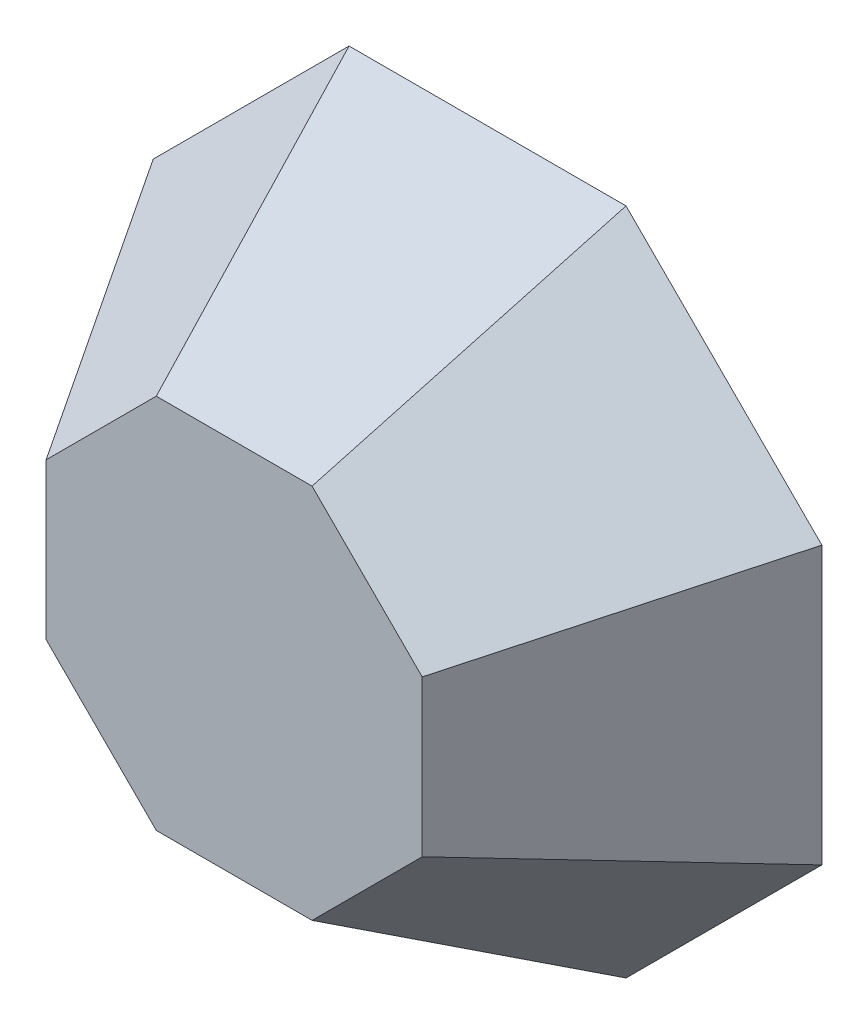
ISO-10303-21;
HEADER;
FILE_DESCRIPTION(('STEP AP214'),'2;1');
FILE_NAME('part.step','',(''),(''),'','','');
FILE_SCHEMA(('AUTOMOTIVE_DESIGN { 1 0 10303 214 1 1 1 1 }'));
ENDSEC;
DATA;
#1=APPLICATION_CONTEXT('core data for automotive mechanical design processes');
#2=APPLICATION_PROTOCOL_DEFINITION('international standard','automotive_design',2000,#1);
#3=PRODUCT_CONTEXT('',#1,'mechanical');
#4=PRODUCT('Part','Part','',(#3));
#5=PRODUCT_RELATED_PRODUCT_CATEGORY('part','',(#4));
#6=PRODUCT_DEFINITION_FORMATION('','',#4);
#7=PRODUCT_DEFINITION_CONTEXT('part definition',#1,'design');
#8=PRODUCT_DEFINITION('design','',#6,#7);
#9=PRODUCT_DEFINITION_SHAPE('','',#8);
#10=(LENGTH_UNIT() NAMED_UNIT(*) SI_UNIT(.MILLI.,.METRE.));
#11=(NAMED_UNIT(*) PLANE_ANGLE_UNIT() SI_UNIT($,.RADIAN.));
#12=(NAMED_UNIT(*) SI_UNIT($,.STERADIAN.) SOLID_ANGLE_UNIT());
#13=UNCERTAINTY_MEASURE_WITH_UNIT(LENGTH_MEASURE(1.E-05),#10,'distance_accuracy_value','');
#14=(GEOMETRIC_REPRESENTATION_CONTEXT(3) GLOBAL_UNCERTAINTY_ASSIGNED_CONTEXT((#13)) GLOBAL_UNIT_ASSIGNED_CONTEXT((#10,
#11,#12)) REPRESENTATION_CONTEXT('',''));
#15=CARTESIAN_POINT('',(0.,0.,0.));
#16=DIRECTION('',(0.,0.,1.));
#17=DIRECTION('',(1.,0.,0.));
#18=AXIS2_PLACEMENT_3D('',#15,#16,#17);
#19=CARTESIAN_POINT('',(21.862191822052,-52.78,0.));
#20=DIRECTION('',(0.612372435695794,-0.612372435695794,0.500000000000001));
#21=DIRECTION('',(0.707106781186547,0.707106781186548,0.));
#22=AXIS2_PLACEMENT_3D('',#19,#20,#21);
#23=PLANE('',#22);
#24=DIRECTION('',(0.707106781186547,0.707106781186548,0.));
#25=VECTOR('',#24,1.);
#26=CARTESIAN_POINT('',(21.862191822052,-52.78,0.));
#27=LINE('',#26,#25);
#28=CARTESIAN_POINT('',(21.862191822052,-52.78,0.));
#29=VERTEX_POINT('',#28);
#30=CARTESIAN_POINT('',(52.78,-21.862191822052,0.));
#31=VERTEX_POINT('',#30);
#32=EDGE_CURVE('E103',#29,#31,#27,.T.);
#33=ORIENTED_EDGE('',*,*,#32,.T.);
#34=DIRECTION('',(0.489609778037477,-0.202803010333604,-0.84802901144343));
#35=VECTOR('',#34,1.);
#36=CARTESIAN_POINT('',(52.78,-21.862191822052,0.));
#37=LINE('',#36,#35);
#38=CARTESIAN_POINT('',(29.6859892324149,-12.2963393525279,40.));
#39=VERTEX_POINT('',#38);
#40=EDGE_CURVE('E11',#39,#31,#37,.T.);
#41=ORIENTED_EDGE('',*,*,#40,.F.);
#42=DIRECTION('',(-0.707106781186547,-0.707106781186548,0.));
#43=VECTOR('',#42,1.);
#44=CARTESIAN_POINT('',(5.5322602034974,-36.4500683814455,40.));
#45=LINE('',#44,#43);
#46=CARTESIAN_POINT('',(12.2963393525279,-29.685989232415,40.));
#47=VERTEX_POINT('',#46);
#48=EDGE_CURVE('E128',#47,#39,#45,.F.);
#49=ORIENTED_EDGE('',*,*,#48,.F.);
#50=DIRECTION('',(0.202803010333604,-0.489609778037477,-0.84802901144343));
#51=VECTOR('',#50,1.);
#52=CARTESIAN_POINT('',(21.862191822052,-52.78,0.));
#53=LINE('',#52,#51);
#54=EDGE_CURVE('E115',#47,#29,#53,.T.);
#55=ORIENTED_EDGE('',*,*,#54,.T.);
#56=EDGE_LOOP('',(#33,#41,#49,#55));
#57=FACE_BOUND('',#56,.T.);
#58=ADVANCED_FACE('F33',(#57),#23,.T.);
#59=CARTESIAN_POINT('',(52.78,-21.862191822052,0.));
#60=DIRECTION('',(0.866025403784438,0.,0.500000000000001));
#61=DIRECTION('',(0.500000000000001,0.,-0.866025403784438));
#62=AXIS2_PLACEMENT_3D('',#59,#60,#61);
#63=PLANE('',#62);
#64=DIRECTION('',(0.,1.,0.));
#65=VECTOR('',#64,1.);
#66=CARTESIAN_POINT('',(52.78,-21.862191822052,0.));
#67=LINE('',#66,#65);
#68=CARTESIAN_POINT('',(52.78,21.862191822052,0.));
#69=VERTEX_POINT('',#68);
#70=EDGE_CURVE('E99',#31,#69,#67,.T.);
#71=ORIENTED_EDGE('',*,*,#70,.T.);
#72=DIRECTION('',(0.489609778037477,0.202803010333604,-0.84802901144343));
#73=VECTOR('',#72,1.);
#74=CARTESIAN_POINT('',(52.78,21.862191822052,0.));
#75=LINE('',#74,#73);
#76=CARTESIAN_POINT('',(29.6859892324149,12.2963393525279,40.));
#77=VERTEX_POINT('',#76);
#78=EDGE_CURVE('E42',#77,#69,#75,.T.);
#79=ORIENTED_EDGE('',*,*,#78,.F.);
#80=DIRECTION('',(0.,-1.,0.));
#81=VECTOR('',#80,1.);
#82=CARTESIAN_POINT('',(29.6859892324149,-21.862191822052,40.));
#83=LINE('',#82,#81);
#84=EDGE_CURVE('E111',#39,#77,#83,.F.);
#85=ORIENTED_EDGE('',*,*,#84,.F.);
#86=ORIENTED_EDGE('',*,*,#40,.T.);
#87=EDGE_LOOP('',(#71,#79,#85,#86));
#88=FACE_BOUND('',#87,.T.);
#89=ADVANCED_FACE('F35',(#88),#63,.T.);
#90=CARTESIAN_POINT('',(52.78,21.862191822052,0.));
#91=DIRECTION('',(0.612372435695794,0.612372435695794,0.500000000000001));
#92=DIRECTION('',(-0.707106781186548,0.707106781186547,0.));
#93=AXIS2_PLACEMENT_3D('',#90,#91,#92);
#94=PLANE('',#93);
#95=DIRECTION('',(-0.707106781186547,0.707106781186547,0.));
#96=VECTOR('',#95,1.);
#97=CARTESIAN_POINT('',(52.78,21.862191822052,0.));
#98=LINE('',#97,#96);
#99=CARTESIAN_POINT('',(21.862191822052,52.78,0.));
#100=VERTEX_POINT('',#99);
#101=EDGE_CURVE('E105',#69,#100,#98,.T.);
#102=ORIENTED_EDGE('',*,*,#101,.T.);
#103=DIRECTION('',(0.202803010333604,0.489609778037477,-0.84802901144343));
#104=VECTOR('',#103,1.);
#105=CARTESIAN_POINT('',(21.862191822052,52.78,0.));
#106=LINE('',#105,#104);
#107=CARTESIAN_POINT('',(12.2963393525279,29.6859892324149,40.));
#108=VERTEX_POINT('',#107);
#109=EDGE_CURVE('E143',#108,#100,#106,.T.);
#110=ORIENTED_EDGE('',*,*,#109,.F.);
#111=DIRECTION('',(0.707106781186548,-0.707106781186547,0.));
#112=VECTOR('',#111,1.);
#113=CARTESIAN_POINT('',(36.4500683814454,5.53226020349742,40.));
#114=LINE('',#113,#112);
#115=EDGE_CURVE('E149',#77,#108,#114,.F.);
#116=ORIENTED_EDGE('',*,*,#115,.F.);
#117=ORIENTED_EDGE('',*,*,#78,.T.);
#118=EDGE_LOOP('',(#102,#110,#116,#117));
#119=FACE_BOUND('',#118,.T.);
#120=ADVANCED_FACE('F172',(#119),#94,.T.);
#121=CARTESIAN_POINT('',(21.862191822052,52.78,0.));
#122=DIRECTION('',(0.,0.866025403784438,0.500000000000001));
#123=DIRECTION('',(0.,-0.500000000000001,0.866025403784438));
#124=AXIS2_PLACEMENT_3D('',#121,#122,#123);
#125=PLANE('',#124);
#126=DIRECTION('',(-1.,0.,0.));
#127=VECTOR('',#126,1.);
#128=CARTESIAN_POINT('',(21.862191822052,52.78,0.));
#129=LINE('',#128,#127);
#130=CARTESIAN_POINT('',(-21.862191822052,52.78,0.));
#131=VERTEX_POINT('',#130);
#132=EDGE_CURVE('E119',#100,#131,#129,.T.);
#133=ORIENTED_EDGE('',*,*,#132,.T.);
#134=DIRECTION('',(-0.202803010333604,0.489609778037477,-0.84802901144343));
#135=VECTOR('',#134,1.);
#136=CARTESIAN_POINT('',(-21.862191822052,52.78,0.));
#137=LINE('',#136,#135);
#138=CARTESIAN_POINT('',(-12.2963393525279,29.6859892324149,40.));
#139=VERTEX_POINT('',#138);
#140=EDGE_CURVE('E140',#139,#131,#137,.T.);
#141=ORIENTED_EDGE('',*,*,#140,.F.);
#142=DIRECTION('',(1.,0.,0.));
#143=VECTOR('',#142,1.);
#144=CARTESIAN_POINT('',(21.862191822052,29.6859892324149,40.));
#145=LINE('',#144,#143);
#146=EDGE_CURVE('E151',#108,#139,#145,.F.);
#147=ORIENTED_EDGE('',*,*,#146,.F.);
#148=ORIENTED_EDGE('',*,*,#109,.T.);
#149=EDGE_LOOP('',(#133,#141,#147,#148));
#150=FACE_BOUND('',#149,.T.);
#151=ADVANCED_FACE('F176',(#150),#125,.T.);
#152=CARTESIAN_POINT('',(-21.862191822052,52.78,0.));
#153=DIRECTION('',(-0.612372435695794,0.612372435695794,0.500000000000001));
#154=DIRECTION('',(-0.707106781186547,-0.707106781186548,0.));
#155=AXIS2_PLACEMENT_3D('',#152,#153,#154);
#156=PLANE('',#155);
#157=DIRECTION('',(-0.707106781186547,-0.707106781186548,0.));
#158=VECTOR('',#157,1.);
#159=CARTESIAN_POINT('',(-21.862191822052,52.78,0.));
#160=LINE('',#159,#158);
#161=CARTESIAN_POINT('',(-52.78,21.862191822052,0.));
#162=VERTEX_POINT('',#161);
#163=EDGE_CURVE('E121',#131,#162,#160,.T.);
#164=ORIENTED_EDGE('',*,*,#163,.T.);
#165=DIRECTION('',(-0.489609778037477,0.202803010333604,-0.84802901144343));
#166=VECTOR('',#165,1.);
#167=CARTESIAN_POINT('',(-52.78,21.862191822052,0.));
#168=LINE('',#167,#166);
#169=CARTESIAN_POINT('',(-29.6859892324149,12.2963393525279,40.));
#170=VERTEX_POINT('',#169);
#171=EDGE_CURVE('E137',#170,#162,#168,.T.);
#172=ORIENTED_EDGE('',*,*,#171,.F.);
#173=DIRECTION('',(0.707106781186547,0.707106781186548,0.));
#174=VECTOR('',#173,1.);
#175=CARTESIAN_POINT('',(-5.53226020349742,36.4500683814454,40.));
#176=LINE('',#175,#174);
#177=EDGE_CURVE('E153',#139,#170,#176,.F.);
#178=ORIENTED_EDGE('',*,*,#177,.F.);
#179=ORIENTED_EDGE('',*,*,#140,.T.);
#180=EDGE_LOOP('',(#164,#172,#178,#179));
#181=FACE_BOUND('',#180,.T.);
#182=ADVANCED_FACE('F179',(#181),#156,.T.);
#183=CARTESIAN_POINT('',(-52.78,21.862191822052,0.));
#184=DIRECTION('',(-0.866025403784438,0.,0.500000000000001));
#185=DIRECTION('',(0.500000000000001,0.,0.866025403784438));
#186=AXIS2_PLACEMENT_3D('',#183,#184,#185);
#187=PLANE('',#186);
#188=DIRECTION('',(0.,-1.,0.));
#189=VECTOR('',#188,1.);
#190=CARTESIAN_POINT('',(-52.78,21.862191822052,0.));
#191=LINE('',#190,#189);
#192=CARTESIAN_POINT('',(-52.78,-21.862191822052,0.));
#193=VERTEX_POINT('',#192);
#194=EDGE_CURVE('E123',#162,#193,#191,.T.);
#195=ORIENTED_EDGE('',*,*,#194,.T.);
#196=DIRECTION('',(-0.489609778037477,-0.202803010333604,-0.84802901144343));
#197=VECTOR('',#196,1.);
#198=CARTESIAN_POINT('',(-52.78,-21.862191822052,0.));
#199=LINE('',#198,#197);
#200=CARTESIAN_POINT('',(-29.6859892324149,-12.2963393525279,40.));
#201=VERTEX_POINT('',#200);
#202=EDGE_CURVE('E134',#201,#193,#199,.T.);
#203=ORIENTED_EDGE('',*,*,#202,.F.);
#204=DIRECTION('',(0.,1.,0.));
#205=VECTOR('',#204,1.);
#206=CARTESIAN_POINT('',(-29.6859892324149,21.862191822052,40.));
#207=LINE('',#206,#205);
#208=EDGE_CURVE('E155',#170,#201,#207,.F.);
#209=ORIENTED_EDGE('',*,*,#208,.F.);
#210=ORIENTED_EDGE('',*,*,#171,.T.);
#211=EDGE_LOOP('',(#195,#203,#209,#210));
#212=FACE_BOUND('',#211,.T.);
#213=ADVANCED_FACE('F162',(#212),#187,.T.);
#214=CARTESIAN_POINT('',(-52.78,-21.862191822052,0.));
#215=DIRECTION('',(-0.612372435695794,-0.612372435695794,0.500000000000001));
#216=DIRECTION('',(0.707106781186548,-0.707106781186548,0.));
#217=AXIS2_PLACEMENT_3D('',#214,#215,#216);
#218=PLANE('',#217);
#219=DIRECTION('',(0.707106781186548,-0.707106781186548,0.));
#220=VECTOR('',#219,1.);
#221=CARTESIAN_POINT('',(-52.78,-21.862191822052,0.));
#222=LINE('',#221,#220);
#223=CARTESIAN_POINT('',(-21.8621918220519,-52.78,0.));
#224=VERTEX_POINT('',#223);
#225=EDGE_CURVE('E125',#193,#224,#222,.T.);
#226=ORIENTED_EDGE('',*,*,#225,.T.);
#227=DIRECTION('',(-0.202803010333604,-0.489609778037477,-0.84802901144343));
#228=VECTOR('',#227,1.);
#229=CARTESIAN_POINT('',(-21.8621918220519,-52.78,0.));
#230=LINE('',#229,#228);
#231=CARTESIAN_POINT('',(-12.2963393525279,-29.685989232415,40.));
#232=VERTEX_POINT('',#231);
#233=EDGE_CURVE('E131',#232,#224,#230,.T.);
#234=ORIENTED_EDGE('',*,*,#233,.F.);
#235=DIRECTION('',(-0.707106781186548,0.707106781186548,0.));
#236=VECTOR('',#235,1.);
#237=CARTESIAN_POINT('',(-36.4500683814454,-5.53226020349741,40.));
#238=LINE('',#237,#236);
#239=EDGE_CURVE('E54',#201,#232,#238,.F.);
#240=ORIENTED_EDGE('',*,*,#239,.F.);
#241=ORIENTED_EDGE('',*,*,#202,.T.);
#242=EDGE_LOOP('',(#226,#234,#240,#241));
#243=FACE_BOUND('',#242,.T.);
#244=ADVANCED_FACE('F166',(#243),#218,.T.);
#245=CARTESIAN_POINT('',(-21.8621918220519,-52.78,0.));
#246=DIRECTION('',(0.,-0.866025403784438,0.500000000000001));
#247=DIRECTION('',(0.,-0.500000000000001,-0.866025403784438));
#248=AXIS2_PLACEMENT_3D('',#245,#246,#247);
#249=PLANE('',#248);
#250=DIRECTION('',(1.,0.,0.));
#251=VECTOR('',#250,1.);
#252=CARTESIAN_POINT('',(-21.8621918220519,-52.78,0.));
#253=LINE('',#252,#251);
#254=EDGE_CURVE('E127',#224,#29,#253,.T.);
#255=ORIENTED_EDGE('',*,*,#254,.T.);
#256=ORIENTED_EDGE('',*,*,#54,.F.);
#257=DIRECTION('',(-1.,0.,0.));
#258=VECTOR('',#257,1.);
#259=CARTESIAN_POINT('',(-21.8621918220519,-29.685989232415,40.));
#260=LINE('',#259,#258);
#261=EDGE_CURVE('E37',#232,#47,#260,.F.);
#262=ORIENTED_EDGE('',*,*,#261,.F.);
#263=ORIENTED_EDGE('',*,*,#233,.T.);
#264=EDGE_LOOP('',(#255,#256,#262,#263));
#265=FACE_BOUND('',#264,.T.);
#266=ADVANCED_FACE('F168',(#265),#249,.T.);
#267=CARTESIAN_POINT('',(0.,0.,40.));
#268=DIRECTION('',(0.,0.,1.));
#269=DIRECTION('',(1.,0.,0.));
#270=AXIS2_PLACEMENT_3D('',#267,#268,#269);
#271=PLANE('',#270);
#272=ORIENTED_EDGE('',*,*,#48,.T.);
#273=ORIENTED_EDGE('',*,*,#84,.T.);
#274=ORIENTED_EDGE('',*,*,#115,.T.);
#275=ORIENTED_EDGE('',*,*,#146,.T.);
#276=ORIENTED_EDGE('',*,*,#177,.T.);
#277=ORIENTED_EDGE('',*,*,#208,.T.);
#278=ORIENTED_EDGE('',*,*,#239,.T.);
#279=ORIENTED_EDGE('',*,*,#261,.T.);
#280=EDGE_LOOP('',(#272,#273,#274,#275,#276,#277,#278,#279));
#281=FACE_BOUND('',#280,.T.);
#282=ADVANCED_FACE('F158',(#281),#271,.T.);
#283=CARTESIAN_POINT('',(0.,0.,0.));
#284=DIRECTION('',(0.,0.,1.));
#285=DIRECTION('',(1.,0.,0.));
#286=AXIS2_PLACEMENT_3D('',#283,#284,#285);
#287=PLANE('',#286);
#288=ORIENTED_EDGE('',*,*,#32,.F.);
#289=ORIENTED_EDGE('',*,*,#254,.F.);
#290=ORIENTED_EDGE('',*,*,#225,.F.);
#291=ORIENTED_EDGE('',*,*,#194,.F.);
#292=ORIENTED_EDGE('',*,*,#163,.F.);
#293=ORIENTED_EDGE('',*,*,#132,.F.);
#294=ORIENTED_EDGE('',*,*,#101,.F.);
#295=ORIENTED_EDGE('',*,*,#70,.F.);
#296=EDGE_LOOP('',(#288,#289,#290,#291,#292,#293,#294,#295));
#297=FACE_BOUND('',#296,.T.);
#298=ADVANCED_FACE('F100',(#297),#287,.F.);
#299=CLOSED_SHELL('',(#58,#89,#120,#151,#182,#213,#244,#266,#282,#298));
#300=MANIFOLD_SOLID_BREP('B2',#299);
#301=ADVANCED_BREP_SHAPE_REPRESENTATION('',(#18,#300),#14);
#302=SHAPE_DEFINITION_REPRESENTATION(#9,#301);
ENDSEC;
END-ISO-10303-21;
